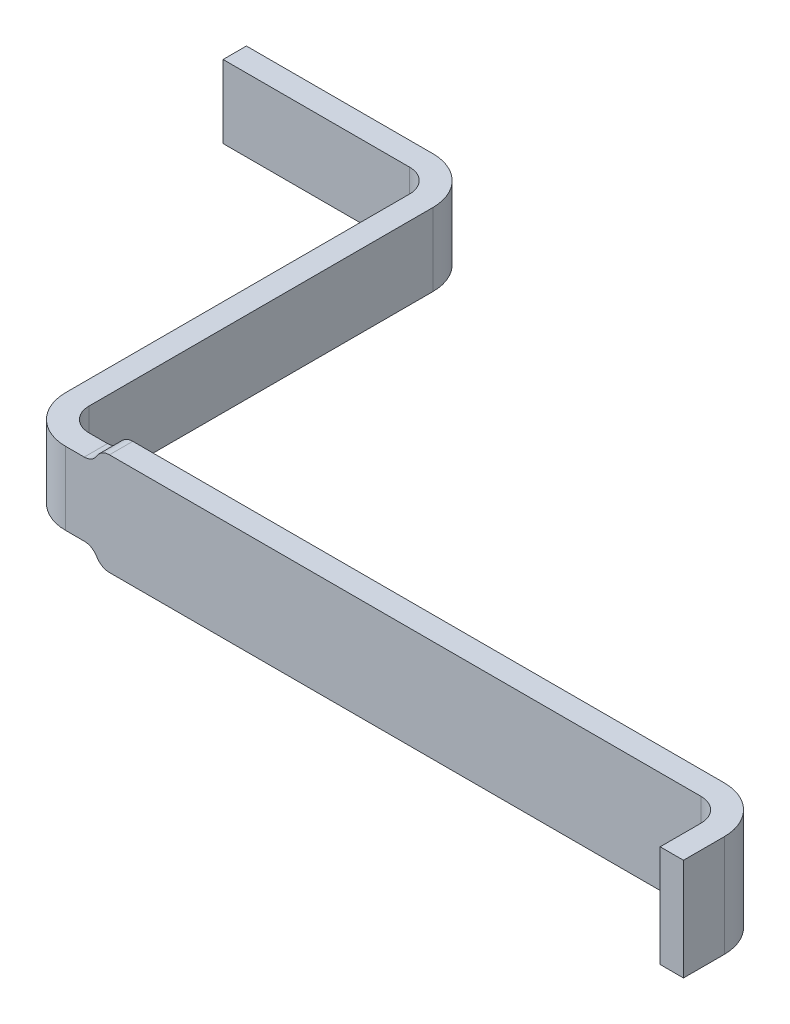
ISO-10303-21;
HEADER;
FILE_DESCRIPTION(('STEP AP214'),'2;1');
FILE_NAME('part.step','',(''),(''),'','','');
FILE_SCHEMA(('AUTOMOTIVE_DESIGN { 1 0 10303 214 1 1 1 1 }'));
ENDSEC;
DATA;
#1=APPLICATION_CONTEXT('core data for automotive mechanical design processes');
#2=APPLICATION_PROTOCOL_DEFINITION('international standard','automotive_design',2000,#1);
#3=PRODUCT_CONTEXT('',#1,'mechanical');
#4=PRODUCT('Part','Part','',(#3));
#5=PRODUCT_RELATED_PRODUCT_CATEGORY('part','',(#4));
#6=PRODUCT_DEFINITION_FORMATION('','',#4);
#7=PRODUCT_DEFINITION_CONTEXT('part definition',#1,'design');
#8=PRODUCT_DEFINITION('design','',#6,#7);
#9=PRODUCT_DEFINITION_SHAPE('','',#8);
#10=(LENGTH_UNIT() NAMED_UNIT(*) SI_UNIT(.MILLI.,.METRE.));
#11=(NAMED_UNIT(*) PLANE_ANGLE_UNIT() SI_UNIT($,.RADIAN.));
#12=(NAMED_UNIT(*) SI_UNIT($,.STERADIAN.) SOLID_ANGLE_UNIT());
#13=UNCERTAINTY_MEASURE_WITH_UNIT(LENGTH_MEASURE(1.E-05),#10,'distance_accuracy_value','');
#14=(GEOMETRIC_REPRESENTATION_CONTEXT(3) GLOBAL_UNCERTAINTY_ASSIGNED_CONTEXT((#13)) GLOBAL_UNIT_ASSIGNED_CONTEXT((#10,
#11,#12)) REPRESENTATION_CONTEXT('',''));
#15=CARTESIAN_POINT('',(0.,0.,0.));
#16=DIRECTION('',(0.,0.,1.));
#17=DIRECTION('',(1.,0.,0.));
#18=AXIS2_PLACEMENT_3D('',#15,#16,#17);
#19=CARTESIAN_POINT('',(1.22,-0.185,1.44));
#20=DIRECTION('',(-1.,0.,0.));
#21=DIRECTION('',(0.,0.,1.));
#22=AXIS2_PLACEMENT_3D('',#19,#20,#21);
#23=PLANE('',#22);
#24=DIRECTION('',(0.,-1.,0.));
#25=VECTOR('',#24,1.);
#26=CARTESIAN_POINT('',(1.22,0.,1.59));
#27=LINE('',#26,#25);
#28=CARTESIAN_POINT('',(1.22,0.175,1.59));
#29=VERTEX_POINT('',#28);
#30=CARTESIAN_POINT('',(1.22,-0.175,1.59));
#31=VERTEX_POINT('',#30);
#32=EDGE_CURVE('E195',#29,#31,#27,.T.);
#33=ORIENTED_EDGE('',*,*,#32,.F.);
#34=DIRECTION('',(0.,0.,1.));
#35=VECTOR('',#34,1.);
#36=CARTESIAN_POINT('',(1.22,0.175,1.52));
#37=LINE('',#36,#35);
#38=CARTESIAN_POINT('',(1.22,0.175,1.45));
#39=VERTEX_POINT('',#38);
#40=EDGE_CURVE('E192',#39,#29,#37,.T.);
#41=ORIENTED_EDGE('',*,*,#40,.F.);
#42=DIRECTION('',(0.,1.,0.));
#43=VECTOR('',#42,1.);
#44=CARTESIAN_POINT('',(1.22,0.,1.45));
#45=LINE('',#44,#43);
#46=CARTESIAN_POINT('',(1.22,-0.175,1.45));
#47=VERTEX_POINT('',#46);
#48=EDGE_CURVE('E148',#47,#39,#45,.T.);
#49=ORIENTED_EDGE('',*,*,#48,.F.);
#50=DIRECTION('',(0.,0.,-1.));
#51=VECTOR('',#50,1.);
#52=CARTESIAN_POINT('',(1.22,-0.175,1.52));
#53=LINE('',#52,#51);
#54=EDGE_CURVE('E186',#31,#47,#53,.T.);
#55=ORIENTED_EDGE('',*,*,#54,.F.);
#56=EDGE_LOOP('',(#33,#41,#49,#55));
#57=FACE_BOUND('',#56,.T.);
#58=ADVANCED_FACE('F17',(#57),#23,.T.);
#59=CARTESIAN_POINT('',(1.212,0.185,1.59));
#60=DIRECTION('',(0.,0.,1.));
#61=DIRECTION('',(0.,-1.,0.));
#62=AXIS2_PLACEMENT_3D('',#59,#60,#61);
#63=PLANE('',#62);
#64=DIRECTION('',(0.,-1.,0.));
#65=VECTOR('',#64,1.);
#66=CARTESIAN_POINT('',(1.3,0.,1.59));
#67=LINE('',#66,#65);
#68=CARTESIAN_POINT('',(1.3,0.175,1.59));
#69=VERTEX_POINT('',#68);
#70=CARTESIAN_POINT('',(1.3,-0.175,1.59));
#71=VERTEX_POINT('',#70);
#72=EDGE_CURVE('E202',#69,#71,#67,.T.);
#73=ORIENTED_EDGE('',*,*,#72,.F.);
#74=DIRECTION('',(1.,0.,0.));
#75=VECTOR('',#74,1.);
#76=CARTESIAN_POINT('',(1.26,0.175,1.59));
#77=LINE('',#76,#75);
#78=EDGE_CURVE('E194',#29,#69,#77,.T.);
#79=ORIENTED_EDGE('',*,*,#78,.F.);
#80=ORIENTED_EDGE('',*,*,#32,.T.);
#81=DIRECTION('',(-1.,0.,0.));
#82=VECTOR('',#81,1.);
#83=CARTESIAN_POINT('',(1.26,-0.175,1.59));
#84=LINE('',#83,#82);
#85=EDGE_CURVE('E189',#71,#31,#84,.T.);
#86=ORIENTED_EDGE('',*,*,#85,.F.);
#87=EDGE_LOOP('',(#73,#79,#80,#86));
#88=FACE_BOUND('',#87,.T.);
#89=ADVANCED_FACE('F411',(#88),#63,.T.);
#90=CARTESIAN_POINT('',(1.14,0.175,1.45));
#91=DIRECTION('',(0.,-1.,0.));
#92=DIRECTION('',(0.,0.,-1.));
#93=AXIS2_PLACEMENT_3D('',#90,#91,#92);
#94=CYLINDRICAL_SURFACE('',#93,0.0799999999999997);
#95=DIRECTION('',(0.,1.,0.));
#96=VECTOR('',#95,1.);
#97=CARTESIAN_POINT('',(1.14,0.,1.37));
#98=LINE('',#97,#96);
#99=CARTESIAN_POINT('',(1.14,-0.175,1.37));
#100=VERTEX_POINT('',#99);
#101=CARTESIAN_POINT('',(1.14,0.175,1.37));
#102=VERTEX_POINT('',#101);
#103=EDGE_CURVE('E146',#100,#102,#98,.T.);
#104=ORIENTED_EDGE('',*,*,#103,.F.);
#105=CARTESIAN_POINT('',(1.14,-0.175,1.45));
#106=DIRECTION('',(0.,-1.,0.));
#107=DIRECTION('',(0.,0.,-1.));
#108=AXIS2_PLACEMENT_3D('',#105,#106,#107);
#109=CIRCLE('',#108,0.0799999999999997);
#110=EDGE_CURVE('E152',#47,#100,#109,.F.);
#111=ORIENTED_EDGE('',*,*,#110,.F.);
#112=ORIENTED_EDGE('',*,*,#48,.T.);
#113=CARTESIAN_POINT('',(1.14,0.175,1.45));
#114=DIRECTION('',(0.,-1.,0.));
#115=DIRECTION('',(0.,0.,-1.));
#116=AXIS2_PLACEMENT_3D('',#113,#114,#115);
#117=CIRCLE('',#116,0.0799999999999997);
#118=EDGE_CURVE('E21',#102,#39,#117,.T.);
#119=ORIENTED_EDGE('',*,*,#118,.F.);
#120=EDGE_LOOP('',(#104,#111,#112,#119));
#121=FACE_BOUND('',#120,.T.);
#122=ADVANCED_FACE('F144',(#121),#94,.F.);
#123=CARTESIAN_POINT('',(1.3,0.185,1.6));
#124=DIRECTION('',(1.,0.,0.));
#125=DIRECTION('',(0.,-1.,0.));
#126=AXIS2_PLACEMENT_3D('',#123,#124,#125);
#127=PLANE('',#126);
#128=ORIENTED_EDGE('',*,*,#72,.T.);
#129=DIRECTION('',(0.,0.,-1.));
#130=VECTOR('',#129,1.);
#131=CARTESIAN_POINT('',(1.3,-0.175,1.52));
#132=LINE('',#131,#130);
#133=CARTESIAN_POINT('',(1.3,-0.175,1.45));
#134=VERTEX_POINT('',#133);
#135=EDGE_CURVE('E153',#71,#134,#132,.T.);
#136=ORIENTED_EDGE('',*,*,#135,.T.);
#137=DIRECTION('',(0.,-1.,0.));
#138=VECTOR('',#137,1.);
#139=CARTESIAN_POINT('',(1.3,0.,1.45));
#140=LINE('',#139,#138);
#141=CARTESIAN_POINT('',(1.3,0.175,1.45));
#142=VERTEX_POINT('',#141);
#143=EDGE_CURVE('E169',#142,#134,#140,.T.);
#144=ORIENTED_EDGE('',*,*,#143,.F.);
#145=DIRECTION('',(0.,0.,1.));
#146=VECTOR('',#145,1.);
#147=CARTESIAN_POINT('',(1.3,0.175,1.52));
#148=LINE('',#147,#146);
#149=EDGE_CURVE('E185',#142,#69,#148,.T.);
#150=ORIENTED_EDGE('',*,*,#149,.T.);
#151=EDGE_LOOP('',(#128,#136,#144,#150));
#152=FACE_BOUND('',#151,.T.);
#153=ADVANCED_FACE('F406',(#152),#127,.T.);
#154=CARTESIAN_POINT('',(-1.05,-0.185,1.37));
#155=DIRECTION('',(0.,0.,1.));
#156=DIRECTION('',(1.,0.,0.));
#157=AXIS2_PLACEMENT_3D('',#154,#155,#156);
#158=PLANE('',#157);
#159=CARTESIAN_POINT('',(-0.89,0.125,1.37));
#160=DIRECTION('',(0.,0.,1.));
#161=DIRECTION('',(1.,0.,0.));
#162=AXIS2_PLACEMENT_3D('',#159,#160,#161);
#163=CIRCLE('',#162,0.0500000000000004);
#164=CARTESIAN_POINT('',(-0.933301270189222,0.149999999999999,1.37));
#165=VERTEX_POINT('',#164);
#166=CARTESIAN_POINT('',(-0.89,0.175,1.37));
#167=VERTEX_POINT('',#166);
#168=EDGE_CURVE('E174',#165,#167,#163,.F.);
#169=ORIENTED_EDGE('',*,*,#168,.F.);
#170=CARTESIAN_POINT('',(-0.976602540378444,0.174999999999998,1.37));
#171=DIRECTION('',(0.,0.,-1.));
#172=DIRECTION('',(0.,1.,0.));
#173=AXIS2_PLACEMENT_3D('',#170,#171,#172);
#174=CIRCLE('',#173,0.0499999999999987);
#175=CARTESIAN_POINT('',(-0.976602540378444,0.124999999999999,1.37));
#176=VERTEX_POINT('',#175);
#177=EDGE_CURVE('E267',#176,#165,#174,.F.);
#178=ORIENTED_EDGE('',*,*,#177,.F.);
#179=DIRECTION('',(1.,0.,0.));
#180=VECTOR('',#179,1.);
#181=CARTESIAN_POINT('',(-1.00830127018922,0.124999999999999,1.37));
#182=LINE('',#181,#180);
#183=CARTESIAN_POINT('',(-1.04,0.124999999999999,1.37));
#184=VERTEX_POINT('',#183);
#185=EDGE_CURVE('E163',#184,#176,#182,.T.);
#186=ORIENTED_EDGE('',*,*,#185,.F.);
#187=DIRECTION('',(0.,-1.,0.));
#188=VECTOR('',#187,1.);
#189=CARTESIAN_POINT('',(-1.04,0.,1.37));
#190=LINE('',#189,#188);
#191=CARTESIAN_POINT('',(-1.04,-0.124999999999999,1.37));
#192=VERTEX_POINT('',#191);
#193=EDGE_CURVE('E180',#184,#192,#190,.T.);
#194=ORIENTED_EDGE('',*,*,#193,.T.);
#195=DIRECTION('',(1.,0.,0.));
#196=VECTOR('',#195,1.);
#197=CARTESIAN_POINT('',(0.0500000000000001,-0.124999999999999,1.37));
#198=LINE('',#197,#196);
#199=CARTESIAN_POINT('',(-0.976602540378444,-0.124999999999999,1.37));
#200=VERTEX_POINT('',#199);
#201=EDGE_CURVE('E183',#192,#200,#198,.T.);
#202=ORIENTED_EDGE('',*,*,#201,.T.);
#203=CARTESIAN_POINT('',(-0.976602540378444,-0.174999999999998,1.37));
#204=DIRECTION('',(0.,0.,-1.));
#205=DIRECTION('',(-1.,0.,0.));
#206=AXIS2_PLACEMENT_3D('',#203,#204,#205);
#207=CIRCLE('',#206,0.049999999999999);
#208=CARTESIAN_POINT('',(-0.933301270189222,-0.149999999999999,1.37));
#209=VERTEX_POINT('',#208);
#210=EDGE_CURVE('E271',#200,#209,#207,.T.);
#211=ORIENTED_EDGE('',*,*,#210,.T.);
#212=CARTESIAN_POINT('',(-0.89,-0.124999999999999,1.37));
#213=DIRECTION('',(0.,0.,1.));
#214=DIRECTION('',(1.,0.,0.));
#215=AXIS2_PLACEMENT_3D('',#212,#213,#214);
#216=CIRCLE('',#215,0.0500000000000004);
#217=CARTESIAN_POINT('',(-0.89,-0.175,1.37));
#218=VERTEX_POINT('',#217);
#219=EDGE_CURVE('E164',#209,#218,#216,.T.);
#220=ORIENTED_EDGE('',*,*,#219,.T.);
#221=DIRECTION('',(-1.,0.,0.));
#222=VECTOR('',#221,1.);
#223=CARTESIAN_POINT('',(0.125,-0.175,1.37));
#224=LINE('',#223,#222);
#225=EDGE_CURVE('E162',#100,#218,#224,.T.);
#226=ORIENTED_EDGE('',*,*,#225,.F.);
#227=ORIENTED_EDGE('',*,*,#103,.T.);
#228=DIRECTION('',(1.,0.,0.));
#229=VECTOR('',#228,1.);
#230=CARTESIAN_POINT('',(0.125,0.175,1.37));
#231=LINE('',#230,#229);
#232=EDGE_CURVE('E159',#167,#102,#231,.T.);
#233=ORIENTED_EDGE('',*,*,#232,.F.);
#234=EDGE_LOOP('',(#169,#178,#186,#194,#202,#211,#220,#226,#227,#233));
#235=FACE_BOUND('',#234,.T.);
#236=ADVANCED_FACE('F158',(#235),#158,.T.);
#237=CARTESIAN_POINT('',(-0.976602540378444,0.174999999999998,1.37));
#238=DIRECTION('',(0.,0.,-1.));
#239=DIRECTION('',(0.,1.,0.));
#240=AXIS2_PLACEMENT_3D('',#237,#238,#239);
#241=CYLINDRICAL_SURFACE('',#240,0.0499999999999987);
#242=ORIENTED_EDGE('',*,*,#177,.T.);
#243=DIRECTION('',(0.,0.,1.));
#244=VECTOR('',#243,1.);
#245=CARTESIAN_POINT('',(-0.933301270189222,0.15,1.33));
#246=LINE('',#245,#244);
#247=CARTESIAN_POINT('',(-0.933301270189222,0.15,1.29));
#248=VERTEX_POINT('',#247);
#249=EDGE_CURVE('E266',#248,#165,#246,.T.);
#250=ORIENTED_EDGE('',*,*,#249,.F.);
#251=CARTESIAN_POINT('',(-0.976602540378445,0.174999999999999,1.29));
#252=DIRECTION('',(0.,0.,-1.));
#253=DIRECTION('',(0.,1.,0.));
#254=AXIS2_PLACEMENT_3D('',#251,#252,#253);
#255=CIRCLE('',#254,0.0499999999999987);
#256=CARTESIAN_POINT('',(-0.976602540378444,0.124999999999999,1.29));
#257=VERTEX_POINT('',#256);
#258=EDGE_CURVE('E257',#257,#248,#255,.F.);
#259=ORIENTED_EDGE('',*,*,#258,.F.);
#260=DIRECTION('',(0.,0.,1.));
#261=VECTOR('',#260,1.);
#262=CARTESIAN_POINT('',(-0.976602540378444,0.124999999999999,1.33));
#263=LINE('',#262,#261);
#264=EDGE_CURVE('E269',#257,#176,#263,.T.);
#265=ORIENTED_EDGE('',*,*,#264,.T.);
#266=EDGE_LOOP('',(#242,#250,#259,#265));
#267=FACE_BOUND('',#266,.T.);
#268=ADVANCED_FACE('F579',(#267),#241,.F.);
#269=CARTESIAN_POINT('',(-0.89,0.125,1.29));
#270=DIRECTION('',(0.,0.,1.));
#271=DIRECTION('',(1.,0.,0.));
#272=AXIS2_PLACEMENT_3D('',#269,#270,#271);
#273=CYLINDRICAL_SURFACE('',#272,0.0500000000000004);
#274=ORIENTED_EDGE('',*,*,#168,.T.);
#275=DIRECTION('',(0.,0.,1.));
#276=VECTOR('',#275,1.);
#277=CARTESIAN_POINT('',(-0.89,0.175,1.33));
#278=LINE('',#277,#276);
#279=CARTESIAN_POINT('',(-0.89,0.175,1.29));
#280=VERTEX_POINT('',#279);
#281=EDGE_CURVE('E168',#280,#167,#278,.T.);
#282=ORIENTED_EDGE('',*,*,#281,.F.);
#283=CARTESIAN_POINT('',(-0.89,0.125,1.29));
#284=DIRECTION('',(0.,0.,1.));
#285=DIRECTION('',(1.,0.,0.));
#286=AXIS2_PLACEMENT_3D('',#283,#284,#285);
#287=CIRCLE('',#286,0.0500000000000004);
#288=EDGE_CURVE('E253',#248,#280,#287,.F.);
#289=ORIENTED_EDGE('',*,*,#288,.F.);
#290=ORIENTED_EDGE('',*,*,#249,.T.);
#291=EDGE_LOOP('',(#274,#282,#289,#290));
#292=FACE_BOUND('',#291,.T.);
#293=ADVANCED_FACE('F571',(#292),#273,.T.);
#294=CARTESIAN_POINT('',(-0.9,0.175,1.378));
#295=DIRECTION('',(0.,1.,0.));
#296=DIRECTION('',(1.,0.,0.));
#297=AXIS2_PLACEMENT_3D('',#294,#295,#296);
#298=PLANE('',#297);
#299=ORIENTED_EDGE('',*,*,#232,.T.);
#300=ORIENTED_EDGE('',*,*,#118,.T.);
#301=ORIENTED_EDGE('',*,*,#40,.T.);
#302=ORIENTED_EDGE('',*,*,#78,.T.);
#303=ORIENTED_EDGE('',*,*,#149,.F.);
#304=CARTESIAN_POINT('',(1.14,0.175,1.45));
#305=DIRECTION('',(0.,1.,0.));
#306=DIRECTION('',(0.,0.,1.));
#307=AXIS2_PLACEMENT_3D('',#304,#305,#306);
#308=CIRCLE('',#307,0.16);
#309=CARTESIAN_POINT('',(1.14,0.175,1.29));
#310=VERTEX_POINT('',#309);
#311=EDGE_CURVE('E261',#310,#142,#308,.F.);
#312=ORIENTED_EDGE('',*,*,#311,.F.);
#313=DIRECTION('',(1.,0.,0.));
#314=VECTOR('',#313,1.);
#315=CARTESIAN_POINT('',(0.05,0.175,1.29));
#316=LINE('',#315,#314);
#317=EDGE_CURVE('E256',#280,#310,#316,.T.);
#318=ORIENTED_EDGE('',*,*,#317,.F.);
#319=ORIENTED_EDGE('',*,*,#281,.T.);
#320=EDGE_LOOP('',(#299,#300,#301,#302,#303,#312,#318,#319));
#321=FACE_BOUND('',#320,.T.);
#322=ADVANCED_FACE('F166',(#321),#298,.T.);
#323=CARTESIAN_POINT('',(1.14,-0.175,1.45));
#324=DIRECTION('',(0.,1.,0.));
#325=DIRECTION('',(0.,0.,1.));
#326=AXIS2_PLACEMENT_3D('',#323,#324,#325);
#327=CYLINDRICAL_SURFACE('',#326,0.16);
#328=DIRECTION('',(0.,-1.,0.));
#329=VECTOR('',#328,1.);
#330=CARTESIAN_POINT('',(1.14,0.,1.29));
#331=LINE('',#330,#329);
#332=CARTESIAN_POINT('',(1.14,-0.175,1.29));
#333=VERTEX_POINT('',#332);
#334=EDGE_CURVE('E360',#310,#333,#331,.T.);
#335=ORIENTED_EDGE('',*,*,#334,.F.);
#336=ORIENTED_EDGE('',*,*,#311,.T.);
#337=ORIENTED_EDGE('',*,*,#143,.T.);
#338=CARTESIAN_POINT('',(1.14,-0.175,1.45));
#339=DIRECTION('',(0.,1.,0.));
#340=DIRECTION('',(0.,0.,1.));
#341=AXIS2_PLACEMENT_3D('',#338,#339,#340);
#342=CIRCLE('',#341,0.16);
#343=EDGE_CURVE('E172',#134,#333,#342,.T.);
#344=ORIENTED_EDGE('',*,*,#343,.T.);
#345=EDGE_LOOP('',(#335,#336,#337,#344));
#346=FACE_BOUND('',#345,.T.);
#347=ADVANCED_FACE('F410',(#346),#327,.T.);
#348=CARTESIAN_POINT('',(1.15,-0.175,1.378));
#349=DIRECTION('',(0.,-1.,0.));
#350=DIRECTION('',(-1.,0.,0.));
#351=AXIS2_PLACEMENT_3D('',#348,#349,#350);
#352=PLANE('',#351);
#353=DIRECTION('',(-1.,0.,0.));
#354=VECTOR('',#353,1.);
#355=CARTESIAN_POINT('',(0.05,-0.175,1.29));
#356=LINE('',#355,#354);
#357=CARTESIAN_POINT('',(-0.89,-0.175,1.29));
#358=VERTEX_POINT('',#357);
#359=EDGE_CURVE('E252',#333,#358,#356,.T.);
#360=ORIENTED_EDGE('',*,*,#359,.F.);
#361=ORIENTED_EDGE('',*,*,#343,.F.);
#362=ORIENTED_EDGE('',*,*,#135,.F.);
#363=ORIENTED_EDGE('',*,*,#85,.T.);
#364=ORIENTED_EDGE('',*,*,#54,.T.);
#365=ORIENTED_EDGE('',*,*,#110,.T.);
#366=ORIENTED_EDGE('',*,*,#225,.T.);
#367=DIRECTION('',(0.,0.,1.));
#368=VECTOR('',#367,1.);
#369=CARTESIAN_POINT('',(-0.89,-0.174999999999999,1.33));
#370=LINE('',#369,#368);
#371=EDGE_CURVE('E388',#358,#218,#370,.T.);
#372=ORIENTED_EDGE('',*,*,#371,.F.);
#373=EDGE_LOOP('',(#360,#361,#362,#363,#364,#365,#366,#372));
#374=FACE_BOUND('',#373,.T.);
#375=ADVANCED_FACE('F275',(#374),#352,.T.);
#376=CARTESIAN_POINT('',(-0.89,-0.124999999999999,1.29));
#377=DIRECTION('',(0.,0.,1.));
#378=DIRECTION('',(1.,0.,0.));
#379=AXIS2_PLACEMENT_3D('',#376,#377,#378);
#380=CYLINDRICAL_SURFACE('',#379,0.0500000000000004);
#381=ORIENTED_EDGE('',*,*,#219,.F.);
#382=DIRECTION('',(0.,0.,1.));
#383=VECTOR('',#382,1.);
#384=CARTESIAN_POINT('',(-0.933301270189222,-0.149999999999999,1.33));
#385=LINE('',#384,#383);
#386=CARTESIAN_POINT('',(-0.933301270189222,-0.149999999999999,1.29));
#387=VERTEX_POINT('',#386);
#388=EDGE_CURVE('E383',#387,#209,#385,.T.);
#389=ORIENTED_EDGE('',*,*,#388,.F.);
#390=CARTESIAN_POINT('',(-0.89,-0.124999999999999,1.29));
#391=DIRECTION('',(0.,0.,1.));
#392=DIRECTION('',(1.,0.,0.));
#393=AXIS2_PLACEMENT_3D('',#390,#391,#392);
#394=CIRCLE('',#393,0.0500000000000004);
#395=EDGE_CURVE('E249',#358,#387,#394,.F.);
#396=ORIENTED_EDGE('',*,*,#395,.F.);
#397=ORIENTED_EDGE('',*,*,#371,.T.);
#398=EDGE_LOOP('',(#381,#389,#396,#397));
#399=FACE_BOUND('',#398,.T.);
#400=ADVANCED_FACE('F541',(#399),#380,.T.);
#401=CARTESIAN_POINT('',(-0.976602540378444,-0.174999999999998,1.37));
#402=DIRECTION('',(0.,0.,-1.));
#403=DIRECTION('',(-1.,0.,0.));
#404=AXIS2_PLACEMENT_3D('',#401,#402,#403);
#405=CYLINDRICAL_SURFACE('',#404,0.049999999999999);
#406=ORIENTED_EDGE('',*,*,#210,.F.);
#407=DIRECTION('',(0.,0.,1.));
#408=VECTOR('',#407,1.);
#409=CARTESIAN_POINT('',(-0.976602540378444,-0.124999999999999,1.33));
#410=LINE('',#409,#408);
#411=CARTESIAN_POINT('',(-0.976602540378444,-0.124999999999999,1.29));
#412=VERTEX_POINT('',#411);
#413=EDGE_CURVE('E245',#412,#200,#410,.T.);
#414=ORIENTED_EDGE('',*,*,#413,.F.);
#415=CARTESIAN_POINT('',(-0.976602540378444,-0.174999999999998,1.29));
#416=DIRECTION('',(0.,0.,-1.));
#417=DIRECTION('',(-1.,0.,0.));
#418=AXIS2_PLACEMENT_3D('',#415,#416,#417);
#419=CIRCLE('',#418,0.049999999999999);
#420=EDGE_CURVE('E246',#387,#412,#419,.F.);
#421=ORIENTED_EDGE('',*,*,#420,.F.);
#422=ORIENTED_EDGE('',*,*,#388,.T.);
#423=EDGE_LOOP('',(#406,#414,#421,#422));
#424=FACE_BOUND('',#423,.T.);
#425=ADVANCED_FACE('F457',(#424),#405,.F.);
#426=CARTESIAN_POINT('',(-1.92,-0.134999999999999,-0.0420000000000008));
#427=DIRECTION('',(-1.,0.,0.));
#428=DIRECTION('',(0.,1.,0.));
#429=AXIS2_PLACEMENT_3D('',#426,#427,#428);
#430=PLANE('',#429);
#431=DIRECTION('',(0.,0.,-1.));
#432=VECTOR('',#431,1.);
#433=CARTESIAN_POINT('',(-1.92,-0.124999999999999,-0.0900000000000036));
#434=LINE('',#433,#432);
#435=CARTESIAN_POINT('',(-1.92,-0.124999999999999,-0.0500000000000051));
#436=VERTEX_POINT('',#435);
#437=CARTESIAN_POINT('',(-1.92,-0.124999999999999,-0.130000000000005));
#438=VERTEX_POINT('',#437);
#439=EDGE_CURVE('E314',#436,#438,#434,.T.);
#440=ORIENTED_EDGE('',*,*,#439,.F.);
#441=DIRECTION('',(0.,-1.,0.));
#442=VECTOR('',#441,1.);
#443=CARTESIAN_POINT('',(-1.92,0.,-0.0500000000000052));
#444=LINE('',#443,#442);
#445=CARTESIAN_POINT('',(-1.92,0.125,-0.0500000000000038));
#446=VERTEX_POINT('',#445);
#447=EDGE_CURVE('E364',#446,#436,#444,.T.);
#448=ORIENTED_EDGE('',*,*,#447,.F.);
#449=DIRECTION('',(0.,0.,-1.));
#450=VECTOR('',#449,1.);
#451=CARTESIAN_POINT('',(-1.92,0.125,-0.0900000000000009));
#452=LINE('',#451,#450);
#453=CARTESIAN_POINT('',(-1.92,0.125,-0.130000000000005));
#454=VERTEX_POINT('',#453);
#455=EDGE_CURVE('E368',#446,#454,#452,.T.);
#456=ORIENTED_EDGE('',*,*,#455,.T.);
#457=DIRECTION('',(0.,1.,0.));
#458=VECTOR('',#457,1.);
#459=CARTESIAN_POINT('',(-1.92,0.,-0.130000000000005));
#460=LINE('',#459,#458);
#461=EDGE_CURVE('E355',#438,#454,#460,.T.);
#462=ORIENTED_EDGE('',*,*,#461,.F.);
#463=EDGE_LOOP('',(#440,#448,#456,#462));
#464=FACE_BOUND('',#463,.T.);
#465=ADVANCED_FACE('F419',(#464),#430,.T.);
#466=CARTESIAN_POINT('',(-1.93,-0.134999999999999,-0.0500000000000052));
#467=DIRECTION('',(0.,0.,1.));
#468=DIRECTION('',(1.,0.,0.));
#469=AXIS2_PLACEMENT_3D('',#466,#467,#468);
#470=PLANE('',#469);
#471=DIRECTION('',(-1.,0.,0.));
#472=VECTOR('',#471,1.);
#473=CARTESIAN_POINT('',(-1.6,-0.124999999999999,-0.0500000000000044));
#474=LINE('',#473,#472);
#475=CARTESIAN_POINT('',(-1.28,-0.124999999999999,-0.0500000000000009));
#476=VERTEX_POINT('',#475);
#477=EDGE_CURVE('E244',#476,#436,#474,.T.);
#478=ORIENTED_EDGE('',*,*,#477,.F.);
#479=DIRECTION('',(0.,-1.,0.));
#480=VECTOR('',#479,1.);
#481=CARTESIAN_POINT('',(-1.28,0.,-0.0499999999999981));
#482=LINE('',#481,#480);
#483=CARTESIAN_POINT('',(-1.28,0.125,-0.0500000000000009));
#484=VERTEX_POINT('',#483);
#485=EDGE_CURVE('E236',#484,#476,#482,.T.);
#486=ORIENTED_EDGE('',*,*,#485,.F.);
#487=DIRECTION('',(-1.,0.,0.));
#488=VECTOR('',#487,1.);
#489=CARTESIAN_POINT('',(-1.6,0.125,-0.0500000000000045));
#490=LINE('',#489,#488);
#491=EDGE_CURVE('E365',#484,#446,#490,.T.);
#492=ORIENTED_EDGE('',*,*,#491,.T.);
#493=ORIENTED_EDGE('',*,*,#447,.T.);
#494=EDGE_LOOP('',(#478,#486,#492,#493));
#495=FACE_BOUND('',#494,.T.);
#496=ADVANCED_FACE('F448',(#495),#470,.T.);
#497=CARTESIAN_POINT('',(1.15,0.185,1.29));
#498=DIRECTION('',(0.,0.,-1.));
#499=DIRECTION('',(0.,-1.,0.));
#500=AXIS2_PLACEMENT_3D('',#497,#498,#499);
#501=PLANE('',#500);
#502=DIRECTION('',(1.,0.,0.));
#503=VECTOR('',#502,1.);
#504=CARTESIAN_POINT('',(-1.00830127018922,-0.124999999999999,1.29));
#505=LINE('',#504,#503);
#506=CARTESIAN_POINT('',(-1.04,-0.124999999999999,1.29));
#507=VERTEX_POINT('',#506);
#508=EDGE_CURVE('E345',#507,#412,#505,.T.);
#509=ORIENTED_EDGE('',*,*,#508,.F.);
#510=DIRECTION('',(0.,-1.,0.));
#511=VECTOR('',#510,1.);
#512=CARTESIAN_POINT('',(-1.04,0.,1.29));
#513=LINE('',#512,#511);
#514=CARTESIAN_POINT('',(-1.04,0.124999999999999,1.29));
#515=VERTEX_POINT('',#514);
#516=EDGE_CURVE('E232',#515,#507,#513,.T.);
#517=ORIENTED_EDGE('',*,*,#516,.F.);
#518=DIRECTION('',(1.,0.,0.));
#519=VECTOR('',#518,1.);
#520=CARTESIAN_POINT('',(0.05,0.124999999999999,1.29));
#521=LINE('',#520,#519);
#522=EDGE_CURVE('E260',#515,#257,#521,.T.);
#523=ORIENTED_EDGE('',*,*,#522,.T.);
#524=ORIENTED_EDGE('',*,*,#258,.T.);
#525=ORIENTED_EDGE('',*,*,#288,.T.);
#526=ORIENTED_EDGE('',*,*,#317,.T.);
#527=ORIENTED_EDGE('',*,*,#334,.T.);
#528=ORIENTED_EDGE('',*,*,#359,.T.);
#529=ORIENTED_EDGE('',*,*,#395,.T.);
#530=ORIENTED_EDGE('',*,*,#420,.T.);
#531=EDGE_LOOP('',(#509,#517,#523,#524,#525,#526,#527,#528,#529,#530));
#532=FACE_BOUND('',#531,.T.);
#533=ADVANCED_FACE('F450',(#532),#501,.T.);
#534=CARTESIAN_POINT('',(-1.27,0.135,-0.130000000000004));
#535=DIRECTION('',(0.,0.,-1.));
#536=DIRECTION('',(0.,-1.,0.));
#537=AXIS2_PLACEMENT_3D('',#534,#535,#536);
#538=PLANE('',#537);
#539=DIRECTION('',(1.,0.,0.));
#540=VECTOR('',#539,1.);
#541=CARTESIAN_POINT('',(-1.6,-0.124999999999999,-0.130000000000005));
#542=LINE('',#541,#540);
#543=CARTESIAN_POINT('',(-1.28,-0.124999999999999,-0.130000000000001));
#544=VERTEX_POINT('',#543);
#545=EDGE_CURVE('E240',#438,#544,#542,.T.);
#546=ORIENTED_EDGE('',*,*,#545,.F.);
#547=ORIENTED_EDGE('',*,*,#461,.T.);
#548=DIRECTION('',(1.,0.,0.));
#549=VECTOR('',#548,1.);
#550=CARTESIAN_POINT('',(-1.6,0.125,-0.130000000000005));
#551=LINE('',#550,#549);
#552=CARTESIAN_POINT('',(-1.28,0.125,-0.130000000000001));
#553=VERTEX_POINT('',#552);
#554=EDGE_CURVE('E248',#454,#553,#551,.T.);
#555=ORIENTED_EDGE('',*,*,#554,.T.);
#556=DIRECTION('',(0.,1.,0.));
#557=VECTOR('',#556,1.);
#558=CARTESIAN_POINT('',(-1.28,0.,-0.129999999999998));
#559=LINE('',#558,#557);
#560=EDGE_CURVE('E229',#544,#553,#559,.T.);
#561=ORIENTED_EDGE('',*,*,#560,.F.);
#562=EDGE_LOOP('',(#546,#547,#555,#561));
#563=FACE_BOUND('',#562,.T.);
#564=ADVANCED_FACE('F305',(#563),#538,.T.);
#565=CARTESIAN_POINT('',(-1.04,-0.124999999999999,1.21));
#566=DIRECTION('',(0.,1.,0.));
#567=DIRECTION('',(0.,0.,1.));
#568=AXIS2_PLACEMENT_3D('',#565,#566,#567);
#569=CYLINDRICAL_SURFACE('',#568,0.16);
#570=CARTESIAN_POINT('',(-1.04,-0.124999999999999,1.21));
#571=DIRECTION('',(0.,1.,0.));
#572=DIRECTION('',(0.,0.,1.));
#573=AXIS2_PLACEMENT_3D('',#570,#571,#572);
#574=CIRCLE('',#573,0.16);
#575=CARTESIAN_POINT('',(-1.2,-0.124999999999999,1.21));
#576=VERTEX_POINT('',#575);
#577=EDGE_CURVE('E222',#192,#576,#574,.F.);
#578=ORIENTED_EDGE('',*,*,#577,.F.);
#579=ORIENTED_EDGE('',*,*,#193,.F.);
#580=CARTESIAN_POINT('',(-1.04,0.124999999999999,1.21));
#581=DIRECTION('',(0.,1.,0.));
#582=DIRECTION('',(0.,0.,1.));
#583=AXIS2_PLACEMENT_3D('',#580,#581,#582);
#584=CIRCLE('',#583,0.16);
#585=CARTESIAN_POINT('',(-1.2,0.124999999999999,1.21));
#586=VERTEX_POINT('',#585);
#587=EDGE_CURVE('E241',#184,#586,#584,.F.);
#588=ORIENTED_EDGE('',*,*,#587,.T.);
#589=DIRECTION('',(0.,1.,0.));
#590=VECTOR('',#589,1.);
#591=CARTESIAN_POINT('',(-1.2,0.,1.21));
#592=LINE('',#591,#590);
#593=EDGE_CURVE('E221',#576,#586,#592,.T.);
#594=ORIENTED_EDGE('',*,*,#593,.F.);
#595=EDGE_LOOP('',(#578,#579,#588,#594));
#596=FACE_BOUND('',#595,.T.);
#597=ADVANCED_FACE('F442',(#596),#569,.T.);
#598=CARTESIAN_POINT('',(-1.28,-0.124999999999999,0.0299999999999988));
#599=DIRECTION('',(0.,1.,0.));
#600=DIRECTION('',(0.,0.,1.));
#601=AXIS2_PLACEMENT_3D('',#598,#599,#600);
#602=CYLINDRICAL_SURFACE('',#601,0.0799999999999981);
#603=CARTESIAN_POINT('',(-1.28,-0.124999999999999,0.0299999999999988));
#604=DIRECTION('',(0.,1.,0.));
#605=DIRECTION('',(0.,0.,1.));
#606=AXIS2_PLACEMENT_3D('',#603,#604,#605);
#607=CIRCLE('',#606,0.0799999999999981);
#608=CARTESIAN_POINT('',(-1.2,-0.124999999999999,0.0299999999999989));
#609=VERTEX_POINT('',#608);
#610=EDGE_CURVE('E215',#609,#476,#607,.T.);
#611=ORIENTED_EDGE('',*,*,#610,.F.);
#612=DIRECTION('',(0.,-1.,0.));
#613=VECTOR('',#612,1.);
#614=CARTESIAN_POINT('',(-1.2,0.,0.0299999999999995));
#615=LINE('',#614,#613);
#616=CARTESIAN_POINT('',(-1.2,0.125,0.0299999999999994));
#617=VERTEX_POINT('',#616);
#618=EDGE_CURVE('E432',#617,#609,#615,.T.);
#619=ORIENTED_EDGE('',*,*,#618,.F.);
#620=CARTESIAN_POINT('',(-1.28,0.125,0.0299999999999988));
#621=DIRECTION('',(0.,1.,0.));
#622=DIRECTION('',(0.,0.,1.));
#623=AXIS2_PLACEMENT_3D('',#620,#621,#622);
#624=CIRCLE('',#623,0.0799999999999981);
#625=EDGE_CURVE('E237',#617,#484,#624,.T.);
#626=ORIENTED_EDGE('',*,*,#625,.T.);
#627=ORIENTED_EDGE('',*,*,#485,.T.);
#628=EDGE_LOOP('',(#611,#619,#626,#627));
#629=FACE_BOUND('',#628,.T.);
#630=ADVANCED_FACE('F447',(#629),#602,.F.);
#631=CARTESIAN_POINT('',(-1.208,0.125,0.0199999999999992));
#632=DIRECTION('',(0.,1.,0.));
#633=DIRECTION('',(0.,0.,1.));
#634=AXIS2_PLACEMENT_3D('',#631,#632,#633);
#635=PLANE('',#634);
#636=DIRECTION('',(0.,0.,1.));
#637=VECTOR('',#636,1.);
#638=CARTESIAN_POINT('',(-1.12,0.125,0.62));
#639=LINE('',#638,#637);
#640=CARTESIAN_POINT('',(-1.12,0.125,0.029999999999999));
#641=VERTEX_POINT('',#640);
#642=CARTESIAN_POINT('',(-1.12,0.125,1.21));
#643=VERTEX_POINT('',#642);
#644=EDGE_CURVE('E218',#641,#643,#639,.T.);
#645=ORIENTED_EDGE('',*,*,#644,.F.);
#646=CARTESIAN_POINT('',(-1.28,0.125,0.0299999999999983));
#647=DIRECTION('',(0.,-1.,0.));
#648=DIRECTION('',(0.,0.,-1.));
#649=AXIS2_PLACEMENT_3D('',#646,#647,#648);
#650=CIRCLE('',#649,0.159999999999997);
#651=EDGE_CURVE('E230',#553,#641,#650,.T.);
#652=ORIENTED_EDGE('',*,*,#651,.F.);
#653=ORIENTED_EDGE('',*,*,#554,.F.);
#654=ORIENTED_EDGE('',*,*,#455,.F.);
#655=ORIENTED_EDGE('',*,*,#491,.F.);
#656=ORIENTED_EDGE('',*,*,#625,.F.);
#657=DIRECTION('',(0.,0.,-1.));
#658=VECTOR('',#657,1.);
#659=CARTESIAN_POINT('',(-1.2,0.124999999999999,0.62));
#660=LINE('',#659,#658);
#661=EDGE_CURVE('E225',#586,#617,#660,.T.);
#662=ORIENTED_EDGE('',*,*,#661,.F.);
#663=ORIENTED_EDGE('',*,*,#587,.F.);
#664=ORIENTED_EDGE('',*,*,#185,.T.);
#665=ORIENTED_EDGE('',*,*,#264,.F.);
#666=ORIENTED_EDGE('',*,*,#522,.F.);
#667=CARTESIAN_POINT('',(-1.04,0.124999999999999,1.21));
#668=DIRECTION('',(0.,-1.,0.));
#669=DIRECTION('',(0.,0.,-1.));
#670=AXIS2_PLACEMENT_3D('',#667,#668,#669);
#671=CIRCLE('',#670,0.0800000000000001);
#672=EDGE_CURVE('E233',#643,#515,#671,.F.);
#673=ORIENTED_EDGE('',*,*,#672,.F.);
#674=EDGE_LOOP('',(#645,#652,#653,#654,#655,#656,#662,#663,#664,#665,#666,#673));
#675=FACE_BOUND('',#674,.T.);
#676=ADVANCED_FACE('F329',(#675),#635,.T.);
#677=CARTESIAN_POINT('',(-1.04,0.124999999999999,1.21));
#678=DIRECTION('',(0.,-1.,0.));
#679=DIRECTION('',(0.,0.,-1.));
#680=AXIS2_PLACEMENT_3D('',#677,#678,#679);
#681=CYLINDRICAL_SURFACE('',#680,0.0800000000000001);
#682=CARTESIAN_POINT('',(-1.04,-0.124999999999999,1.21));
#683=DIRECTION('',(0.,-1.,0.));
#684=DIRECTION('',(0.,0.,-1.));
#685=AXIS2_PLACEMENT_3D('',#682,#683,#684);
#686=CIRCLE('',#685,0.0800000000000001);
#687=CARTESIAN_POINT('',(-1.12,-0.124999999999999,1.21));
#688=VERTEX_POINT('',#687);
#689=EDGE_CURVE('E226',#688,#507,#686,.F.);
#690=ORIENTED_EDGE('',*,*,#689,.F.);
#691=DIRECTION('',(0.,-1.,0.));
#692=VECTOR('',#691,1.);
#693=CARTESIAN_POINT('',(-1.12,0.,1.21));
#694=LINE('',#693,#692);
#695=EDGE_CURVE('E342',#643,#688,#694,.T.);
#696=ORIENTED_EDGE('',*,*,#695,.F.);
#697=ORIENTED_EDGE('',*,*,#672,.T.);
#698=ORIENTED_EDGE('',*,*,#516,.T.);
#699=EDGE_LOOP('',(#690,#696,#697,#698));
#700=FACE_BOUND('',#699,.T.);
#701=ADVANCED_FACE('F319',(#700),#681,.F.);
#702=CARTESIAN_POINT('',(-1.28,0.125,0.0299999999999983));
#703=DIRECTION('',(0.,-1.,0.));
#704=DIRECTION('',(0.,0.,-1.));
#705=AXIS2_PLACEMENT_3D('',#702,#703,#704);
#706=CYLINDRICAL_SURFACE('',#705,0.159999999999997);
#707=CARTESIAN_POINT('',(-1.28,-0.124999999999999,0.0299999999999983));
#708=DIRECTION('',(0.,-1.,0.));
#709=DIRECTION('',(0.,0.,-1.));
#710=AXIS2_PLACEMENT_3D('',#707,#708,#709);
#711=CIRCLE('',#710,0.159999999999997);
#712=CARTESIAN_POINT('',(-1.12,-0.124999999999999,0.0299999999999995));
#713=VERTEX_POINT('',#712);
#714=EDGE_CURVE('E219',#544,#713,#711,.T.);
#715=ORIENTED_EDGE('',*,*,#714,.F.);
#716=ORIENTED_EDGE('',*,*,#560,.T.);
#717=ORIENTED_EDGE('',*,*,#651,.T.);
#718=DIRECTION('',(0.,1.,0.));
#719=VECTOR('',#718,1.);
#720=CARTESIAN_POINT('',(-1.12,0.,0.0299999999999995));
#721=LINE('',#720,#719);
#722=EDGE_CURVE('E36',#713,#641,#721,.T.);
#723=ORIENTED_EDGE('',*,*,#722,.F.);
#724=EDGE_LOOP('',(#715,#716,#717,#723));
#725=FACE_BOUND('',#724,.T.);
#726=ADVANCED_FACE('F316',(#725),#706,.T.);
#727=CARTESIAN_POINT('',(-1.2,-0.134999999999999,0.0199999999999995));
#728=DIRECTION('',(-1.,0.,0.));
#729=DIRECTION('',(0.,0.,1.));
#730=AXIS2_PLACEMENT_3D('',#727,#728,#729);
#731=PLANE('',#730);
#732=DIRECTION('',(0.,0.,-1.));
#733=VECTOR('',#732,1.);
#734=CARTESIAN_POINT('',(-1.2,-0.124999999999999,0.62));
#735=LINE('',#734,#733);
#736=EDGE_CURVE('E27',#576,#609,#735,.T.);
#737=ORIENTED_EDGE('',*,*,#736,.F.);
#738=ORIENTED_EDGE('',*,*,#593,.T.);
#739=ORIENTED_EDGE('',*,*,#661,.T.);
#740=ORIENTED_EDGE('',*,*,#618,.T.);
#741=EDGE_LOOP('',(#737,#738,#739,#740));
#742=FACE_BOUND('',#741,.T.);
#743=ADVANCED_FACE('F318',(#742),#731,.T.);
#744=CARTESIAN_POINT('',(-1.12,0.135,1.22));
#745=DIRECTION('',(1.,0.,0.));
#746=DIRECTION('',(0.,-1.,0.));
#747=AXIS2_PLACEMENT_3D('',#744,#745,#746);
#748=PLANE('',#747);
#749=DIRECTION('',(0.,0.,1.));
#750=VECTOR('',#749,1.);
#751=CARTESIAN_POINT('',(-1.12,-0.124999999999999,0.62));
#752=LINE('',#751,#750);
#753=EDGE_CURVE('E11',#713,#688,#752,.T.);
#754=ORIENTED_EDGE('',*,*,#753,.F.);
#755=ORIENTED_EDGE('',*,*,#722,.T.);
#756=ORIENTED_EDGE('',*,*,#644,.T.);
#757=ORIENTED_EDGE('',*,*,#695,.T.);
#758=EDGE_LOOP('',(#754,#755,#756,#757));
#759=FACE_BOUND('',#758,.T.);
#760=ADVANCED_FACE('F326',(#759),#748,.T.);
#761=CARTESIAN_POINT('',(-1.208,-0.124999999999999,1.22));
#762=DIRECTION('',(0.,-1.,0.));
#763=DIRECTION('',(0.,0.,-1.));
#764=AXIS2_PLACEMENT_3D('',#761,#762,#763);
#765=PLANE('',#764);
#766=ORIENTED_EDGE('',*,*,#736,.T.);
#767=ORIENTED_EDGE('',*,*,#610,.T.);
#768=ORIENTED_EDGE('',*,*,#477,.T.);
#769=ORIENTED_EDGE('',*,*,#439,.T.);
#770=ORIENTED_EDGE('',*,*,#545,.T.);
#771=ORIENTED_EDGE('',*,*,#714,.T.);
#772=ORIENTED_EDGE('',*,*,#753,.T.);
#773=ORIENTED_EDGE('',*,*,#689,.T.);
#774=ORIENTED_EDGE('',*,*,#508,.T.);
#775=ORIENTED_EDGE('',*,*,#413,.T.);
#776=ORIENTED_EDGE('',*,*,#201,.F.);
#777=ORIENTED_EDGE('',*,*,#577,.T.);
#778=EDGE_LOOP('',(#766,#767,#768,#769,#770,#771,#772,#773,#774,#775,#776,#777));
#779=FACE_BOUND('',#778,.T.);
#780=ADVANCED_FACE('F19',(#779),#765,.T.);
#781=CLOSED_SHELL('',(#58,#89,#122,#153,#236,#268,#293,#322,#347,#375,#400,#425,#465,#496,#533,
#564,#597,#630,#676,#701,#726,#743,#760,#780));
#782=MANIFOLD_SOLID_BREP('B1',#781);
#783=ADVANCED_BREP_SHAPE_REPRESENTATION('',(#18,#782),#14);
#784=SHAPE_DEFINITION_REPRESENTATION(#9,#783);
ENDSEC;
END-ISO-10303-21;
